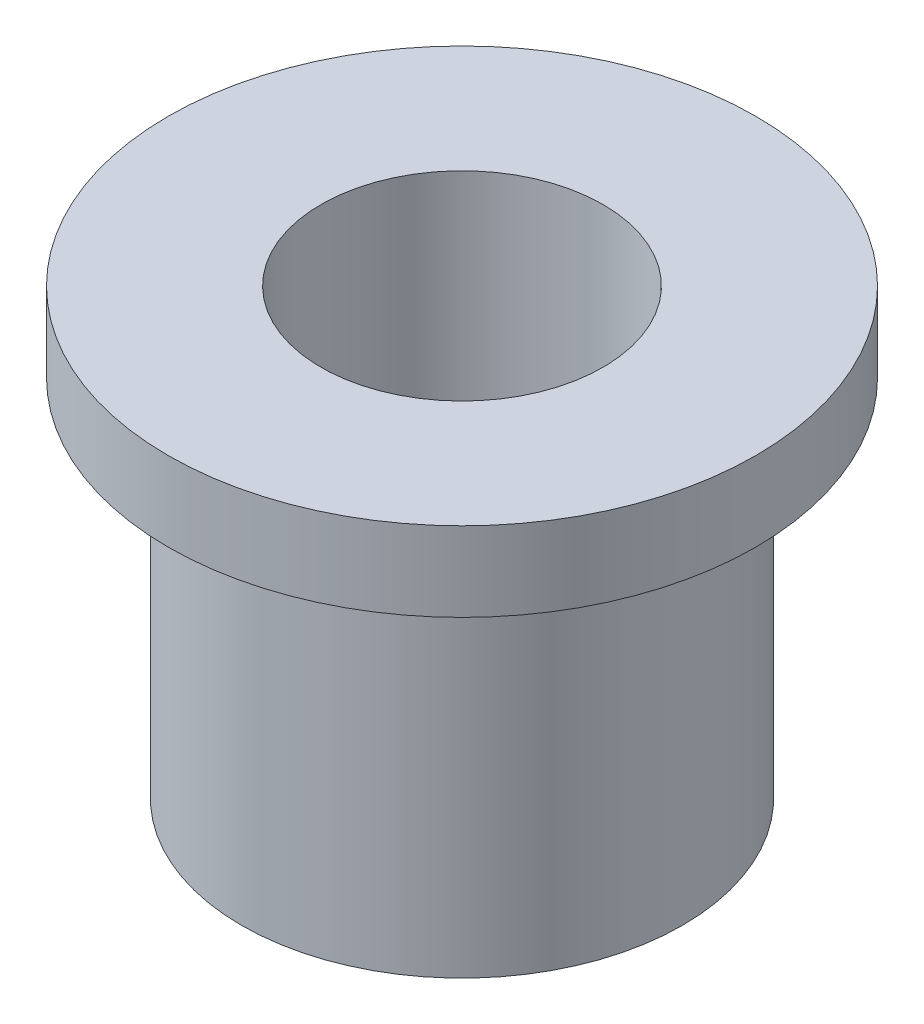
ISO-10303-21;
HEADER;
FILE_DESCRIPTION(('STEP AP214'),'2;1');
FILE_NAME('part.step','',(''),(''),'','','');
FILE_SCHEMA(('AUTOMOTIVE_DESIGN { 1 0 10303 214 1 1 1 1 }'));
ENDSEC;
DATA;
#1=APPLICATION_CONTEXT('core data for automotive mechanical design processes');
#2=APPLICATION_PROTOCOL_DEFINITION('international standard','automotive_design',2000,#1);
#3=PRODUCT_CONTEXT('',#1,'mechanical');
#4=PRODUCT('Part','Part','',(#3));
#5=PRODUCT_RELATED_PRODUCT_CATEGORY('part','',(#4));
#6=PRODUCT_DEFINITION_FORMATION('','',#4);
#7=PRODUCT_DEFINITION_CONTEXT('part definition',#1,'design');
#8=PRODUCT_DEFINITION('design','',#6,#7);
#9=PRODUCT_DEFINITION_SHAPE('','',#8);
#10=(LENGTH_UNIT() NAMED_UNIT(*) SI_UNIT(.MILLI.,.METRE.));
#11=(NAMED_UNIT(*) PLANE_ANGLE_UNIT() SI_UNIT($,.RADIAN.));
#12=(NAMED_UNIT(*) SI_UNIT($,.STERADIAN.) SOLID_ANGLE_UNIT());
#13=UNCERTAINTY_MEASURE_WITH_UNIT(LENGTH_MEASURE(1.E-05),#10,'distance_accuracy_value','');
#14=(GEOMETRIC_REPRESENTATION_CONTEXT(3) GLOBAL_UNCERTAINTY_ASSIGNED_CONTEXT((#13)) GLOBAL_UNIT_ASSIGNED_CONTEXT((#10,
#11,#12)) REPRESENTATION_CONTEXT('',''));
#15=CARTESIAN_POINT('',(0.,0.,0.));
#16=DIRECTION('',(0.,0.,1.));
#17=DIRECTION('',(1.,0.,0.));
#18=AXIS2_PLACEMENT_3D('',#15,#16,#17);
#19=CARTESIAN_POINT('',(162.052,1.7145,-9.525));
#20=DIRECTION('',(0.,-1.,0.));
#21=DIRECTION('',(0.,0.,-1.));
#22=AXIS2_PLACEMENT_3D('',#19,#20,#21);
#23=CYLINDRICAL_SURFACE('',#22,6.35);
#24=CARTESIAN_POINT('',(162.052,1.7145,-9.525));
#25=DIRECTION('',(0.,1.,0.));
#26=DIRECTION('',(0.,0.,1.));
#27=AXIS2_PLACEMENT_3D('',#24,#25,#26);
#28=CIRCLE('',#27,6.35);
#29=CARTESIAN_POINT('',(162.052,1.7145,-3.17500000000001));
#30=VERTEX_POINT('',#29);
#31=EDGE_CURVE('E10',#30,#30,#28,.T.);
#32=ORIENTED_EDGE('',*,*,#31,.F.);
#33=EDGE_LOOP('',(#32));
#34=FACE_BOUND('',#33,.T.);
#35=CARTESIAN_POINT('',(162.052,0.,-9.525));
#36=DIRECTION('',(0.,1.,0.));
#37=DIRECTION('',(0.,0.,1.));
#38=AXIS2_PLACEMENT_3D('',#35,#36,#37);
#39=CIRCLE('',#38,6.35);
#40=CARTESIAN_POINT('',(162.052,0.,-3.17500000000001));
#41=VERTEX_POINT('',#40);
#42=EDGE_CURVE('E37',#41,#41,#39,.T.);
#43=ORIENTED_EDGE('',*,*,#42,.T.);
#44=EDGE_LOOP('',(#43));
#45=FACE_BOUND('',#44,.T.);
#46=ADVANCED_FACE('F30',(#34,#45),#23,.T.);
#47=CARTESIAN_POINT('',(162.052,1.7145,-9.525));
#48=DIRECTION('',(0.,1.,0.));
#49=DIRECTION('',(0.,0.,1.));
#50=AXIS2_PLACEMENT_3D('',#47,#48,#49);
#51=PLANE('',#50);
#52=CARTESIAN_POINT('',(162.052,1.7145,-9.525));
#53=DIRECTION('',(0.,1.,0.));
#54=DIRECTION('',(0.,0.,1.));
#55=AXIS2_PLACEMENT_3D('',#52,#53,#54);
#56=CIRCLE('',#55,3.04800000000001);
#57=CARTESIAN_POINT('',(162.052,1.7145,-12.573));
#58=VERTEX_POINT('',#57);
#59=EDGE_CURVE('E46',#58,#58,#56,.T.);
#60=ORIENTED_EDGE('',*,*,#59,.F.);
#61=EDGE_LOOP('',(#60));
#62=FACE_BOUND('',#61,.T.);
#63=ORIENTED_EDGE('',*,*,#31,.T.);
#64=EDGE_LOOP('',(#63));
#65=FACE_BOUND('',#64,.T.);
#66=ADVANCED_FACE('F71',(#62,#65),#51,.T.);
#67=CARTESIAN_POINT('',(162.052,0.,-9.525));
#68=DIRECTION('',(0.,1.,0.));
#69=DIRECTION('',(0.,0.,1.));
#70=AXIS2_PLACEMENT_3D('',#67,#68,#69);
#71=PLANE('',#70);
#72=CARTESIAN_POINT('',(162.052,0.,-9.525));
#73=DIRECTION('',(0.,1.,0.));
#74=DIRECTION('',(0.,0.,1.));
#75=AXIS2_PLACEMENT_3D('',#72,#73,#74);
#76=CIRCLE('',#75,4.76250000000001);
#77=CARTESIAN_POINT('',(162.052,0.,-4.76249999999999));
#78=VERTEX_POINT('',#77);
#79=EDGE_CURVE('E33',#78,#78,#76,.T.);
#80=ORIENTED_EDGE('',*,*,#79,.T.);
#81=EDGE_LOOP('',(#80));
#82=FACE_BOUND('',#81,.T.);
#83=ORIENTED_EDGE('',*,*,#42,.F.);
#84=EDGE_LOOP('',(#83));
#85=FACE_BOUND('',#84,.T.);
#86=ADVANCED_FACE('F64',(#82,#85),#71,.F.);
#87=CARTESIAN_POINT('',(162.052,-26.6783841816037,-9.525));
#88=DIRECTION('',(0.,1.,0.));
#89=DIRECTION('',(0.,0.,1.));
#90=AXIS2_PLACEMENT_3D('',#87,#88,#89);
#91=CYLINDRICAL_SURFACE('',#90,4.76250000000001);
#92=CARTESIAN_POINT('',(162.052,-7.874,-9.525));
#93=DIRECTION('',(0.,1.,0.));
#94=DIRECTION('',(0.,0.,1.));
#95=AXIS2_PLACEMENT_3D('',#92,#93,#94);
#96=CIRCLE('',#95,4.76250000000001);
#97=CARTESIAN_POINT('',(162.052,-7.874,-4.76249999999999));
#98=VERTEX_POINT('',#97);
#99=EDGE_CURVE('E43',#98,#98,#96,.F.);
#100=ORIENTED_EDGE('',*,*,#99,.F.);
#101=EDGE_LOOP('',(#100));
#102=FACE_BOUND('',#101,.T.);
#103=ORIENTED_EDGE('',*,*,#79,.F.);
#104=EDGE_LOOP('',(#103));
#105=FACE_BOUND('',#104,.T.);
#106=ADVANCED_FACE('F58',(#102,#105),#91,.T.);
#107=CARTESIAN_POINT('',(0.,-7.874,0.));
#108=DIRECTION('',(0.,1.,0.));
#109=DIRECTION('',(0.,0.,1.));
#110=AXIS2_PLACEMENT_3D('',#107,#108,#109);
#111=PLANE('',#110);
#112=CARTESIAN_POINT('',(162.052,-7.874,-9.525));
#113=DIRECTION('',(0.,-1.,0.));
#114=DIRECTION('',(0.,0.,-1.));
#115=AXIS2_PLACEMENT_3D('',#112,#113,#114);
#116=CIRCLE('',#115,3.04800000000001);
#117=CARTESIAN_POINT('',(162.052,-7.874,-12.573));
#118=VERTEX_POINT('',#117);
#119=EDGE_CURVE('E49',#118,#118,#116,.T.);
#120=ORIENTED_EDGE('',*,*,#119,.F.);
#121=EDGE_LOOP('',(#120));
#122=FACE_BOUND('',#121,.T.);
#123=ORIENTED_EDGE('',*,*,#99,.T.);
#124=EDGE_LOOP('',(#123));
#125=FACE_BOUND('',#124,.T.);
#126=ADVANCED_FACE('F55',(#122,#125),#111,.F.);
#127=CARTESIAN_POINT('',(162.052,7.62,-9.525));
#128=DIRECTION('',(0.,-1.,0.));
#129=DIRECTION('',(0.,0.,-1.));
#130=AXIS2_PLACEMENT_3D('',#127,#128,#129);
#131=CYLINDRICAL_SURFACE('',#130,3.04800000000001);
#132=CARTESIAN_POINT('',(162.052,1.7145,-12.573));
#133=CARTESIAN_POINT('',(162.052,1.61461979166667,-12.573));
#134=CARTESIAN_POINT('',(162.052,1.51473958333333,-12.573));
#135=CARTESIAN_POINT('',(162.052,1.31497916666667,-12.573));
#136=CARTESIAN_POINT('',(162.052,1.21509895833333,-12.573));
#137=CARTESIAN_POINT('',(162.052,1.01533854166667,-12.573));
#138=CARTESIAN_POINT('',(162.052,0.915458333333333,-12.573));
#139=CARTESIAN_POINT('',(162.052,0.715697916666667,-12.573));
#140=CARTESIAN_POINT('',(162.052,0.615817708333333,-12.573));
#141=CARTESIAN_POINT('',(162.052,0.416057291666667,-12.573));
#142=CARTESIAN_POINT('',(162.052,0.316177083333333,-12.573));
#143=CARTESIAN_POINT('',(162.052,0.116416666666667,-12.573));
#144=CARTESIAN_POINT('',(162.052,0.0165364583333333,-12.573));
#145=CARTESIAN_POINT('',(162.052,-0.183223958333333,-12.573));
#146=CARTESIAN_POINT('',(162.052,-0.283104166666666,-12.573));
#147=CARTESIAN_POINT('',(162.052,-0.482864583333333,-12.573));
#148=CARTESIAN_POINT('',(162.052,-0.582744791666666,-12.573));
#149=CARTESIAN_POINT('',(162.052,-0.782505208333333,-12.573));
#150=CARTESIAN_POINT('',(162.052,-0.882385416666666,-12.573));
#151=CARTESIAN_POINT('',(162.052,-1.08214583333333,-12.573));
#152=CARTESIAN_POINT('',(162.052,-1.18202604166667,-12.573));
#153=CARTESIAN_POINT('',(162.052,-1.38178645833333,-12.573));
#154=CARTESIAN_POINT('',(162.052,-1.48166666666667,-12.573));
#155=CARTESIAN_POINT('',(162.052,-1.68142708333333,-12.573));
#156=CARTESIAN_POINT('',(162.052,-1.78130729166666,-12.573));
#157=CARTESIAN_POINT('',(162.052,-1.98106770833333,-12.573));
#158=CARTESIAN_POINT('',(162.052,-2.08094791666666,-12.573));
#159=CARTESIAN_POINT('',(162.052,-2.28070833333333,-12.573));
#160=CARTESIAN_POINT('',(162.052,-2.38058854166666,-12.573));
#161=CARTESIAN_POINT('',(162.052,-2.58034895833333,-12.573));
#162=CARTESIAN_POINT('',(162.052,-2.68022916666666,-12.573));
#163=CARTESIAN_POINT('',(162.052,-2.87998958333333,-12.573));
#164=CARTESIAN_POINT('',(162.052,-2.97986979166666,-12.573));
#165=CARTESIAN_POINT('',(162.052,-3.17963020833333,-12.573));
#166=CARTESIAN_POINT('',(162.052,-3.27951041666666,-12.573));
#167=CARTESIAN_POINT('',(162.052,-3.47927083333333,-12.573));
#168=CARTESIAN_POINT('',(162.052,-3.57915104166666,-12.573));
#169=CARTESIAN_POINT('',(162.052,-3.77891145833333,-12.573));
#170=CARTESIAN_POINT('',(162.052,-3.87879166666666,-12.573));
#171=CARTESIAN_POINT('',(162.052,-4.07855208333333,-12.573));
#172=CARTESIAN_POINT('',(162.052,-4.17843229166666,-12.573));
#173=CARTESIAN_POINT('',(162.052,-4.37819270833333,-12.573));
#174=CARTESIAN_POINT('',(162.052,-4.47807291666666,-12.573));
#175=CARTESIAN_POINT('',(162.052,-4.67783333333333,-12.573));
#176=CARTESIAN_POINT('',(162.052,-4.77771354166666,-12.573));
#177=CARTESIAN_POINT('',(162.052,-4.97747395833333,-12.573));
#178=CARTESIAN_POINT('',(162.052,-5.07735416666666,-12.573));
#179=CARTESIAN_POINT('',(162.052,-5.27711458333333,-12.573));
#180=CARTESIAN_POINT('',(162.052,-5.37699479166666,-12.573));
#181=CARTESIAN_POINT('',(162.052,-5.57675520833333,-12.573));
#182=CARTESIAN_POINT('',(162.052,-5.67663541666666,-12.573));
#183=CARTESIAN_POINT('',(162.052,-5.87639583333333,-12.573));
#184=CARTESIAN_POINT('',(162.052,-5.97627604166666,-12.573));
#185=CARTESIAN_POINT('',(162.052,-6.17603645833333,-12.573));
#186=CARTESIAN_POINT('',(162.052,-6.27591666666666,-12.573));
#187=CARTESIAN_POINT('',(162.052,-6.47567708333333,-12.573));
#188=CARTESIAN_POINT('',(162.052,-6.57555729166666,-12.573));
#189=CARTESIAN_POINT('',(162.052,-6.77531770833333,-12.573));
#190=CARTESIAN_POINT('',(162.052,-6.87519791666666,-12.573));
#191=CARTESIAN_POINT('',(162.052,-7.07495833333333,-12.573));
#192=CARTESIAN_POINT('',(162.052,-7.17483854166666,-12.573));
#193=CARTESIAN_POINT('',(162.052,-7.37459895833333,-12.573));
#194=CARTESIAN_POINT('',(162.052,-7.47447916666666,-12.573));
#195=CARTESIAN_POINT('',(162.052,-7.67423958333333,-12.573));
#196=CARTESIAN_POINT('',(162.052,-7.77411979166666,-12.573));
#197=CARTESIAN_POINT('',(162.052,-7.874,-12.573));
#198=B_SPLINE_CURVE_WITH_KNOTS('',3,(#132,#133,#134,#135,#136,#137,#138,#139,#140,#141,#142,
#143,#144,#145,#146,#147,#148,#149,#150,#151,#152,#153,#154,#155,#156,#157,#158,#159,#160,#161,
#162,#163,#164,#165,#166,#167,#168,#169,#170,#171,#172,#173,#174,#175,#176,#177,#178,#179,#180,
#181,#182,#183,#184,#185,#186,#187,#188,#189,#190,#191,#192,#193,#194,#195,#196,#197),
.UNSPECIFIED.,.F.,.F.,(4,2,2,2,2,2,2,2,2,2,2,2,2,2,2,2,2,2,2,2,2,2,2,2,2,2,2,2,2,2,2,2,4),(0.,
0.299640625,0.59928125,0.898921875,1.1985625,1.498203125,1.79784375,2.097484375,2.397125,
2.696765625,2.99640625,3.296046875,3.5956875,3.895328125,4.19496875,4.494609375,4.79425,
5.093890625,5.39353125,5.693171875,5.9928125,6.292453125,6.59209375,6.891734375,7.191375,
7.491015625,7.79065625,8.090296875,8.3899375,8.689578125,8.98921875,9.288859375,9.5885),.UNSPECIFIED.);
#199=EDGE_CURVE('BSEAM53',#58,#118,#198,.T.);
#200=ORIENTED_EDGE('',*,*,#59,.T.);
#201=ORIENTED_EDGE('',*,*,#119,.T.);
#202=ORIENTED_EDGE('',*,*,#199,.T.);
#203=ORIENTED_EDGE('',*,*,#199,.F.);
#204=EDGE_LOOP('',(#200,#202,#201,#203));
#205=FACE_BOUND('',#204,.T.);
#206=ADVANCED_FACE('F53',(#205),#131,.F.);
#207=CLOSED_SHELL('',(#46,#66,#86,#106,#126,#206));
#208=MANIFOLD_SOLID_BREP('B2',#207);
#209=ADVANCED_BREP_SHAPE_REPRESENTATION('',(#18,#208),#14);
#210=SHAPE_DEFINITION_REPRESENTATION(#9,#209);
ENDSEC;
END-ISO-10303-21;
